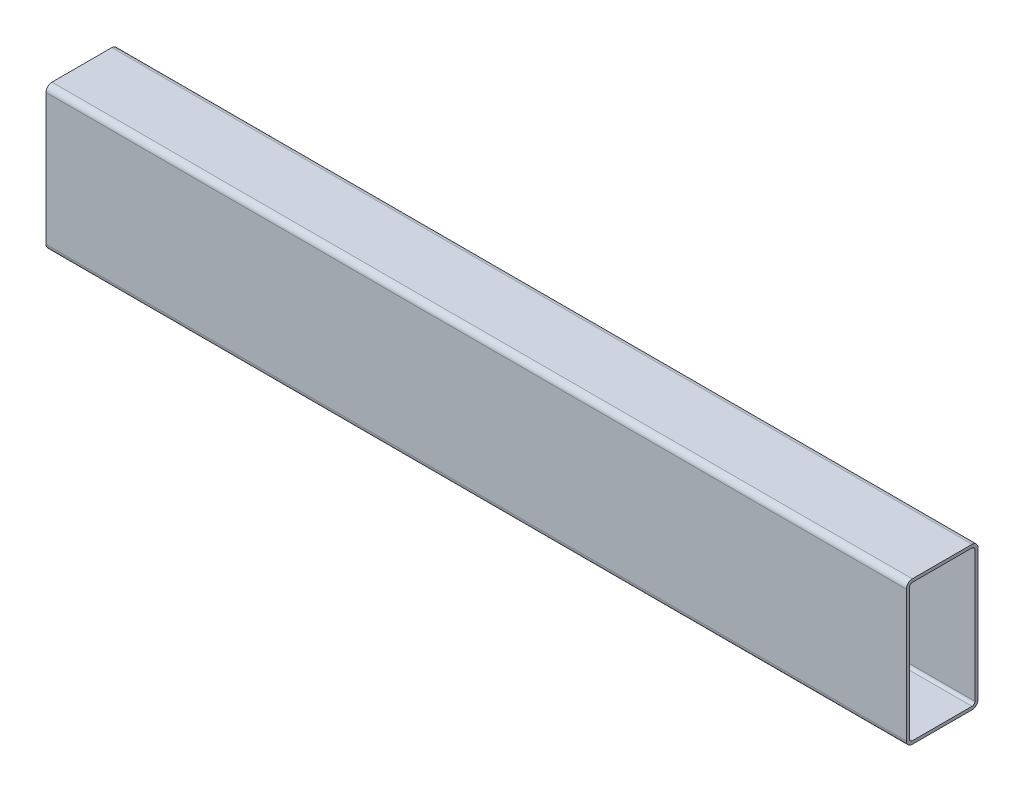
ISO-10303-21;
HEADER;
FILE_DESCRIPTION(('STEP AP214'),'2;1');
FILE_NAME('part.step','',(''),(''),'','','');
FILE_SCHEMA(('AUTOMOTIVE_DESIGN { 1 0 10303 214 1 1 1 1 }'));
ENDSEC;
DATA;
#1=APPLICATION_CONTEXT('core data for automotive mechanical design processes');
#2=APPLICATION_PROTOCOL_DEFINITION('international standard','automotive_design',2000,#1);
#3=PRODUCT_CONTEXT('',#1,'mechanical');
#4=PRODUCT('Part','Part','',(#3));
#5=PRODUCT_RELATED_PRODUCT_CATEGORY('part','',(#4));
#6=PRODUCT_DEFINITION_FORMATION('','',#4);
#7=PRODUCT_DEFINITION_CONTEXT('part definition',#1,'design');
#8=PRODUCT_DEFINITION('design','',#6,#7);
#9=PRODUCT_DEFINITION_SHAPE('','',#8);
#10=(LENGTH_UNIT() NAMED_UNIT(*) SI_UNIT(.MILLI.,.METRE.));
#11=(NAMED_UNIT(*) PLANE_ANGLE_UNIT() SI_UNIT($,.RADIAN.));
#12=(NAMED_UNIT(*) SI_UNIT($,.STERADIAN.) SOLID_ANGLE_UNIT());
#13=UNCERTAINTY_MEASURE_WITH_UNIT(LENGTH_MEASURE(1.E-05),#10,'distance_accuracy_value','');
#14=(GEOMETRIC_REPRESENTATION_CONTEXT(3) GLOBAL_UNCERTAINTY_ASSIGNED_CONTEXT((#13)) GLOBAL_UNIT_ASSIGNED_CONTEXT((#10,
#11,#12)) REPRESENTATION_CONTEXT('',''));
#15=CARTESIAN_POINT('',(0.,0.,0.));
#16=DIRECTION('',(0.,0.,1.));
#17=DIRECTION('',(1.,0.,0.));
#18=AXIS2_PLACEMENT_3D('',#15,#16,#17);
#19=CARTESIAN_POINT('',(457.2,-7.09083333333333,9.49713055555553));
#20=DIRECTION('',(1.,0.,0.));
#21=DIRECTION('',(0.,0.,-1.));
#22=AXIS2_PLACEMENT_3D('',#19,#20,#21);
#23=PLANE('',#22);
#24=CARTESIAN_POINT('',(457.2,-7.09083333333333,9.49713055555553));
#25=DIRECTION('',(1.,0.,0.));
#26=DIRECTION('',(0.,0.,-1.));
#27=AXIS2_PLACEMENT_3D('',#24,#25,#26);
#28=CIRCLE('',#27,3.175);
#29=CARTESIAN_POINT('',(457.2,-7.09083333333333,12.6721305555555));
#30=VERTEX_POINT('',#29);
#31=CARTESIAN_POINT('',(457.2,-10.2658333333333,9.49713055555553));
#32=VERTEX_POINT('',#31);
#33=EDGE_CURVE('E262',#30,#32,#28,.T.);
#34=ORIENTED_EDGE('',*,*,#33,.T.);
#35=DIRECTION('',(0.,0.,-1.));
#36=VECTOR('',#35,1.);
#37=CARTESIAN_POINT('',(457.2,-10.2658333333333,9.49713055555553));
#38=LINE('',#37,#36);
#39=CARTESIAN_POINT('',(457.2,-10.2658333333333,-22.2528694444445));
#40=VERTEX_POINT('',#39);
#41=EDGE_CURVE('E265',#32,#40,#38,.T.);
#42=ORIENTED_EDGE('',*,*,#41,.T.);
#43=CARTESIAN_POINT('',(457.2,-7.09083333333333,-22.2528694444445));
#44=DIRECTION('',(1.,0.,0.));
#45=DIRECTION('',(0.,0.,-1.));
#46=AXIS2_PLACEMENT_3D('',#43,#44,#45);
#47=CIRCLE('',#46,3.175);
#48=CARTESIAN_POINT('',(457.2,-7.09083333333333,-25.4278694444445));
#49=VERTEX_POINT('',#48);
#50=EDGE_CURVE('E268',#40,#49,#47,.T.);
#51=ORIENTED_EDGE('',*,*,#50,.T.);
#52=DIRECTION('',(0.,1.,0.));
#53=VECTOR('',#52,1.);
#54=CARTESIAN_POINT('',(457.2,-7.09083333333333,-25.4278694444445));
#55=LINE('',#54,#53);
#56=CARTESIAN_POINT('',(457.2,62.7591666666666,-25.4278694444445));
#57=VERTEX_POINT('',#56);
#58=EDGE_CURVE('E270',#49,#57,#55,.T.);
#59=ORIENTED_EDGE('',*,*,#58,.T.);
#60=CARTESIAN_POINT('',(457.2,62.7591666666667,-22.2528694444445));
#61=DIRECTION('',(1.,0.,0.));
#62=DIRECTION('',(0.,0.,-1.));
#63=AXIS2_PLACEMENT_3D('',#60,#61,#62);
#64=CIRCLE('',#63,3.175);
#65=CARTESIAN_POINT('',(457.2,65.9341666666667,-22.2528694444445));
#66=VERTEX_POINT('',#65);
#67=EDGE_CURVE('E272',#57,#66,#64,.T.);
#68=ORIENTED_EDGE('',*,*,#67,.T.);
#69=DIRECTION('',(0.,0.,-1.));
#70=VECTOR('',#69,1.);
#71=CARTESIAN_POINT('',(457.2,65.9341666666667,9.4971305555555));
#72=LINE('',#71,#70);
#73=CARTESIAN_POINT('',(457.2,65.9341666666667,9.4971305555555));
#74=VERTEX_POINT('',#73);
#75=EDGE_CURVE('E274',#74,#66,#72,.T.);
#76=ORIENTED_EDGE('',*,*,#75,.F.);
#77=CARTESIAN_POINT('',(457.2,62.7591666666667,9.49713055555553));
#78=DIRECTION('',(-1.,0.,0.));
#79=DIRECTION('',(0.,0.,1.));
#80=AXIS2_PLACEMENT_3D('',#77,#78,#79);
#81=CIRCLE('',#80,3.175);
#82=CARTESIAN_POINT('',(457.2,62.7591666666666,12.6721305555555));
#83=VERTEX_POINT('',#82);
#84=EDGE_CURVE('E277',#83,#74,#81,.T.);
#85=ORIENTED_EDGE('',*,*,#84,.F.);
#86=DIRECTION('',(0.,1.,0.));
#87=VECTOR('',#86,1.);
#88=CARTESIAN_POINT('',(457.2,-7.09083333333333,12.6721305555555));
#89=LINE('',#88,#87);
#90=EDGE_CURVE('E280',#30,#83,#89,.T.);
#91=ORIENTED_EDGE('',*,*,#90,.F.);
#92=EDGE_LOOP('',(#34,#42,#51,#59,#68,#76,#85,#91));
#93=FACE_BOUND('',#92,.T.);
#94=DIRECTION('',(0.,0.,-1.));
#95=VECTOR('',#94,1.);
#96=CARTESIAN_POINT('',(457.2,-8.61483333333334,9.49713055555553));
#97=LINE('',#96,#95);
#98=CARTESIAN_POINT('',(457.2,-8.61483333333334,9.49713055555553));
#99=VERTEX_POINT('',#98);
#100=CARTESIAN_POINT('',(457.2,-8.61483333333334,-22.2528694444445));
#101=VERTEX_POINT('',#100);
#102=EDGE_CURVE('E204',#99,#101,#97,.T.);
#103=ORIENTED_EDGE('',*,*,#102,.F.);
#104=CARTESIAN_POINT('',(457.2,-7.09083333333333,9.49713055555553));
#105=DIRECTION('',(1.,0.,0.));
#106=DIRECTION('',(0.,0.,-1.));
#107=AXIS2_PLACEMENT_3D('',#104,#105,#106);
#108=CIRCLE('',#107,1.524);
#109=CARTESIAN_POINT('',(457.2,-7.09083333333333,11.0211305555555));
#110=VERTEX_POINT('',#109);
#111=EDGE_CURVE('E195',#110,#99,#108,.T.);
#112=ORIENTED_EDGE('',*,*,#111,.F.);
#113=DIRECTION('',(0.,1.,0.));
#114=VECTOR('',#113,1.);
#115=CARTESIAN_POINT('',(457.2,-7.09083333333333,11.0211305555555));
#116=LINE('',#115,#114);
#117=CARTESIAN_POINT('',(457.2,62.7591666666666,11.0211305555555));
#118=VERTEX_POINT('',#117);
#119=EDGE_CURVE('E229',#110,#118,#116,.T.);
#120=ORIENTED_EDGE('',*,*,#119,.T.);
#121=CARTESIAN_POINT('',(457.2,62.7591666666667,9.49713055555553));
#122=DIRECTION('',(1.,0.,0.));
#123=DIRECTION('',(0.,0.,-1.));
#124=AXIS2_PLACEMENT_3D('',#121,#122,#123);
#125=CIRCLE('',#124,1.524);
#126=CARTESIAN_POINT('',(457.2,64.2831666666667,9.49713055555551));
#127=VERTEX_POINT('',#126);
#128=EDGE_CURVE('E98',#118,#127,#125,.F.);
#129=ORIENTED_EDGE('',*,*,#128,.T.);
#130=DIRECTION('',(0.,0.,-1.));
#131=VECTOR('',#130,1.);
#132=CARTESIAN_POINT('',(457.2,64.2831666666667,9.4971305555555));
#133=LINE('',#132,#131);
#134=CARTESIAN_POINT('',(457.2,64.2831666666667,-22.2528694444444));
#135=VERTEX_POINT('',#134);
#136=EDGE_CURVE('E225',#127,#135,#133,.T.);
#137=ORIENTED_EDGE('',*,*,#136,.T.);
#138=CARTESIAN_POINT('',(457.2,62.7591666666667,-22.2528694444445));
#139=DIRECTION('',(1.,0.,0.));
#140=DIRECTION('',(0.,0.,-1.));
#141=AXIS2_PLACEMENT_3D('',#138,#139,#140);
#142=CIRCLE('',#141,1.524);
#143=CARTESIAN_POINT('',(457.2,62.7591666666666,-23.7768694444445));
#144=VERTEX_POINT('',#143);
#145=EDGE_CURVE('E223',#144,#135,#142,.T.);
#146=ORIENTED_EDGE('',*,*,#145,.F.);
#147=DIRECTION('',(0.,1.,0.));
#148=VECTOR('',#147,1.);
#149=CARTESIAN_POINT('',(457.2,-7.09083333333333,-23.7768694444445));
#150=LINE('',#149,#148);
#151=CARTESIAN_POINT('',(457.2,-7.09083333333333,-23.7768694444445));
#152=VERTEX_POINT('',#151);
#153=EDGE_CURVE('E219',#152,#144,#150,.T.);
#154=ORIENTED_EDGE('',*,*,#153,.F.);
#155=CARTESIAN_POINT('',(457.2,-7.09083333333333,-22.2528694444445));
#156=DIRECTION('',(1.,0.,0.));
#157=DIRECTION('',(0.,0.,-1.));
#158=AXIS2_PLACEMENT_3D('',#155,#156,#157);
#159=CIRCLE('',#158,1.524);
#160=EDGE_CURVE('E217',#101,#152,#159,.T.);
#161=ORIENTED_EDGE('',*,*,#160,.F.);
#162=EDGE_LOOP('',(#103,#112,#120,#129,#137,#146,#154,#161));
#163=FACE_BOUND('',#162,.T.);
#164=ADVANCED_FACE('F83',(#93,#163),#23,.T.);
#165=CARTESIAN_POINT('',(0.,-7.09083333333333,9.49713055555553));
#166=DIRECTION('',(1.,0.,0.));
#167=DIRECTION('',(0.,0.,-1.));
#168=AXIS2_PLACEMENT_3D('',#165,#166,#167);
#169=PLANE('',#168);
#170=CARTESIAN_POINT('',(0.,-7.09083333333333,9.49713055555553));
#171=DIRECTION('',(1.,0.,0.));
#172=DIRECTION('',(0.,0.,-1.));
#173=AXIS2_PLACEMENT_3D('',#170,#171,#172);
#174=CIRCLE('',#173,3.175);
#175=CARTESIAN_POINT('',(0.,-7.09083333333333,12.6721305555555));
#176=VERTEX_POINT('',#175);
#177=CARTESIAN_POINT('',(0.,-10.2658333333333,9.49713055555553));
#178=VERTEX_POINT('',#177);
#179=EDGE_CURVE('E212',#176,#178,#174,.T.);
#180=ORIENTED_EDGE('',*,*,#179,.F.);
#181=DIRECTION('',(0.,1.,0.));
#182=VECTOR('',#181,1.);
#183=CARTESIAN_POINT('',(0.,-7.09083333333333,12.6721305555555));
#184=LINE('',#183,#182);
#185=CARTESIAN_POINT('',(0.,62.7591666666666,12.6721305555555));
#186=VERTEX_POINT('',#185);
#187=EDGE_CURVE('E266',#176,#186,#184,.T.);
#188=ORIENTED_EDGE('',*,*,#187,.T.);
#189=CARTESIAN_POINT('',(0.,62.7591666666667,9.49713055555553));
#190=DIRECTION('',(-1.,0.,0.));
#191=DIRECTION('',(0.,0.,1.));
#192=AXIS2_PLACEMENT_3D('',#189,#190,#191);
#193=CIRCLE('',#192,3.175);
#194=CARTESIAN_POINT('',(0.,65.9341666666667,9.4971305555555));
#195=VERTEX_POINT('',#194);
#196=EDGE_CURVE('E298',#186,#195,#193,.T.);
#197=ORIENTED_EDGE('',*,*,#196,.T.);
#198=DIRECTION('',(0.,0.,-1.));
#199=VECTOR('',#198,1.);
#200=CARTESIAN_POINT('',(0.,65.9341666666667,9.4971305555555));
#201=LINE('',#200,#199);
#202=CARTESIAN_POINT('',(0.,65.9341666666667,-22.2528694444445));
#203=VERTEX_POINT('',#202);
#204=EDGE_CURVE('E295',#195,#203,#201,.T.);
#205=ORIENTED_EDGE('',*,*,#204,.T.);
#206=CARTESIAN_POINT('',(0.,62.7591666666667,-22.2528694444445));
#207=DIRECTION('',(1.,0.,0.));
#208=DIRECTION('',(0.,0.,-1.));
#209=AXIS2_PLACEMENT_3D('',#206,#207,#208);
#210=CIRCLE('',#209,3.175);
#211=CARTESIAN_POINT('',(0.,62.7591666666666,-25.4278694444445));
#212=VERTEX_POINT('',#211);
#213=EDGE_CURVE('E292',#212,#203,#210,.T.);
#214=ORIENTED_EDGE('',*,*,#213,.F.);
#215=DIRECTION('',(0.,1.,0.));
#216=VECTOR('',#215,1.);
#217=CARTESIAN_POINT('',(0.,-7.09083333333333,-25.4278694444445));
#218=LINE('',#217,#216);
#219=CARTESIAN_POINT('',(0.,-7.09083333333333,-25.4278694444445));
#220=VERTEX_POINT('',#219);
#221=EDGE_CURVE('E290',#220,#212,#218,.T.);
#222=ORIENTED_EDGE('',*,*,#221,.F.);
#223=CARTESIAN_POINT('',(0.,-7.09083333333333,-22.2528694444445));
#224=DIRECTION('',(1.,0.,0.));
#225=DIRECTION('',(0.,0.,-1.));
#226=AXIS2_PLACEMENT_3D('',#223,#224,#225);
#227=CIRCLE('',#226,3.175);
#228=CARTESIAN_POINT('',(0.,-10.2658333333333,-22.2528694444445));
#229=VERTEX_POINT('',#228);
#230=EDGE_CURVE('E288',#229,#220,#227,.T.);
#231=ORIENTED_EDGE('',*,*,#230,.F.);
#232=DIRECTION('',(0.,0.,-1.));
#233=VECTOR('',#232,1.);
#234=CARTESIAN_POINT('',(0.,-10.2658333333333,9.49713055555553));
#235=LINE('',#234,#233);
#236=EDGE_CURVE('E286',#178,#229,#235,.T.);
#237=ORIENTED_EDGE('',*,*,#236,.F.);
#238=EDGE_LOOP('',(#180,#188,#197,#205,#214,#222,#231,#237));
#239=FACE_BOUND('',#238,.T.);
#240=CARTESIAN_POINT('',(0.,-7.09083333333333,9.49713055555553));
#241=DIRECTION('',(1.,0.,0.));
#242=DIRECTION('',(0.,0.,-1.));
#243=AXIS2_PLACEMENT_3D('',#240,#241,#242);
#244=CIRCLE('',#243,1.524);
#245=CARTESIAN_POINT('',(0.,-7.09083333333333,11.0211305555555));
#246=VERTEX_POINT('',#245);
#247=CARTESIAN_POINT('',(0.,-8.61483333333334,9.49713055555553));
#248=VERTEX_POINT('',#247);
#249=EDGE_CURVE('E106',#246,#248,#244,.T.);
#250=ORIENTED_EDGE('',*,*,#249,.T.);
#251=DIRECTION('',(0.,0.,-1.));
#252=VECTOR('',#251,1.);
#253=CARTESIAN_POINT('',(0.,-8.61483333333334,9.49713055555553));
#254=LINE('',#253,#252);
#255=CARTESIAN_POINT('',(0.,-8.61483333333334,-22.2528694444445));
#256=VERTEX_POINT('',#255);
#257=EDGE_CURVE('E211',#248,#256,#254,.T.);
#258=ORIENTED_EDGE('',*,*,#257,.T.);
#259=CARTESIAN_POINT('',(0.,-7.09083333333333,-22.2528694444445));
#260=DIRECTION('',(1.,0.,0.));
#261=DIRECTION('',(0.,0.,-1.));
#262=AXIS2_PLACEMENT_3D('',#259,#260,#261);
#263=CIRCLE('',#262,1.524);
#264=CARTESIAN_POINT('',(0.,-7.09083333333333,-23.7768694444445));
#265=VERTEX_POINT('',#264);
#266=EDGE_CURVE('E233',#256,#265,#263,.T.);
#267=ORIENTED_EDGE('',*,*,#266,.T.);
#268=DIRECTION('',(0.,1.,0.));
#269=VECTOR('',#268,1.);
#270=CARTESIAN_POINT('',(0.,-7.09083333333333,-23.7768694444445));
#271=LINE('',#270,#269);
#272=CARTESIAN_POINT('',(0.,62.7591666666666,-23.7768694444445));
#273=VERTEX_POINT('',#272);
#274=EDGE_CURVE('E236',#265,#273,#271,.T.);
#275=ORIENTED_EDGE('',*,*,#274,.T.);
#276=CARTESIAN_POINT('',(0.,62.7591666666667,-22.2528694444445));
#277=DIRECTION('',(1.,0.,0.));
#278=DIRECTION('',(0.,0.,-1.));
#279=AXIS2_PLACEMENT_3D('',#276,#277,#278);
#280=CIRCLE('',#279,1.524);
#281=CARTESIAN_POINT('',(0.,64.2831666666667,-22.2528694444444));
#282=VERTEX_POINT('',#281);
#283=EDGE_CURVE('E239',#273,#282,#280,.T.);
#284=ORIENTED_EDGE('',*,*,#283,.T.);
#285=DIRECTION('',(0.,0.,-1.));
#286=VECTOR('',#285,1.);
#287=CARTESIAN_POINT('',(0.,64.2831666666667,9.4971305555555));
#288=LINE('',#287,#286);
#289=CARTESIAN_POINT('',(0.,64.2831666666667,9.49713055555551));
#290=VERTEX_POINT('',#289);
#291=EDGE_CURVE('E242',#290,#282,#288,.T.);
#292=ORIENTED_EDGE('',*,*,#291,.F.);
#293=CARTESIAN_POINT('',(0.,62.7591666666667,9.49713055555553));
#294=DIRECTION('',(1.,0.,0.));
#295=DIRECTION('',(0.,0.,-1.));
#296=AXIS2_PLACEMENT_3D('',#293,#294,#295);
#297=CIRCLE('',#296,1.524);
#298=CARTESIAN_POINT('',(0.,62.7591666666666,11.0211305555555));
#299=VERTEX_POINT('',#298);
#300=EDGE_CURVE('E245',#299,#290,#297,.F.);
#301=ORIENTED_EDGE('',*,*,#300,.F.);
#302=DIRECTION('',(0.,1.,0.));
#303=VECTOR('',#302,1.);
#304=CARTESIAN_POINT('',(0.,-7.09083333333333,11.0211305555555));
#305=LINE('',#304,#303);
#306=EDGE_CURVE('E205',#246,#299,#305,.T.);
#307=ORIENTED_EDGE('',*,*,#306,.F.);
#308=EDGE_LOOP('',(#250,#258,#267,#275,#284,#292,#301,#307));
#309=FACE_BOUND('',#308,.T.);
#310=ADVANCED_FACE('F326',(#239,#309),#169,.F.);
#311=CARTESIAN_POINT('',(457.2,-7.09083333333333,9.49713055555553));
#312=DIRECTION('',(-1.,0.,0.));
#313=DIRECTION('',(0.,0.,1.));
#314=AXIS2_PLACEMENT_3D('',#311,#312,#313);
#315=CYLINDRICAL_SURFACE('',#314,3.175);
#316=ORIENTED_EDGE('',*,*,#179,.T.);
#317=DIRECTION('',(-1.,0.,0.));
#318=VECTOR('',#317,1.);
#319=CARTESIAN_POINT('',(457.2,-10.2658333333333,9.49713055555553));
#320=LINE('',#319,#318);
#321=EDGE_CURVE('E12',#32,#178,#320,.T.);
#322=ORIENTED_EDGE('',*,*,#321,.F.);
#323=ORIENTED_EDGE('',*,*,#33,.F.);
#324=DIRECTION('',(-1.,0.,0.));
#325=VECTOR('',#324,1.);
#326=CARTESIAN_POINT('',(457.2,-7.09083333333333,12.6721305555555));
#327=LINE('',#326,#325);
#328=EDGE_CURVE('E283',#30,#176,#327,.T.);
#329=ORIENTED_EDGE('',*,*,#328,.T.);
#330=EDGE_LOOP('',(#316,#322,#323,#329));
#331=FACE_BOUND('',#330,.T.);
#332=ADVANCED_FACE('F85',(#331),#315,.T.);
#333=CARTESIAN_POINT('',(457.2,-10.2658333333333,9.49713055555553));
#334=DIRECTION('',(0.,1.,0.));
#335=DIRECTION('',(0.,0.,1.));
#336=AXIS2_PLACEMENT_3D('',#333,#334,#335);
#337=PLANE('',#336);
#338=ORIENTED_EDGE('',*,*,#236,.T.);
#339=DIRECTION('',(-1.,0.,0.));
#340=VECTOR('',#339,1.);
#341=CARTESIAN_POINT('',(457.2,-10.2658333333333,-22.2528694444445));
#342=LINE('',#341,#340);
#343=EDGE_CURVE('E91',#40,#229,#342,.T.);
#344=ORIENTED_EDGE('',*,*,#343,.F.);
#345=ORIENTED_EDGE('',*,*,#41,.F.);
#346=ORIENTED_EDGE('',*,*,#321,.T.);
#347=EDGE_LOOP('',(#338,#344,#345,#346));
#348=FACE_BOUND('',#347,.T.);
#349=ADVANCED_FACE('F343',(#348),#337,.F.);
#350=CARTESIAN_POINT('',(457.2,-7.09083333333333,-22.2528694444445));
#351=DIRECTION('',(-1.,0.,0.));
#352=DIRECTION('',(0.,0.,1.));
#353=AXIS2_PLACEMENT_3D('',#350,#351,#352);
#354=CYLINDRICAL_SURFACE('',#353,3.175);
#355=ORIENTED_EDGE('',*,*,#230,.T.);
#356=DIRECTION('',(-1.,0.,0.));
#357=VECTOR('',#356,1.);
#358=CARTESIAN_POINT('',(457.2,-7.09083333333333,-25.4278694444445));
#359=LINE('',#358,#357);
#360=EDGE_CURVE('E313',#49,#220,#359,.T.);
#361=ORIENTED_EDGE('',*,*,#360,.F.);
#362=ORIENTED_EDGE('',*,*,#50,.F.);
#363=ORIENTED_EDGE('',*,*,#343,.T.);
#364=EDGE_LOOP('',(#355,#361,#362,#363));
#365=FACE_BOUND('',#364,.T.);
#366=ADVANCED_FACE('F320',(#365),#354,.T.);
#367=CARTESIAN_POINT('',(457.2,-7.09083333333333,-25.4278694444445));
#368=DIRECTION('',(0.,0.,1.));
#369=DIRECTION('',(1.,0.,0.));
#370=AXIS2_PLACEMENT_3D('',#367,#368,#369);
#371=PLANE('',#370);
#372=ORIENTED_EDGE('',*,*,#221,.T.);
#373=DIRECTION('',(-1.,0.,0.));
#374=VECTOR('',#373,1.);
#375=CARTESIAN_POINT('',(457.2,62.7591666666666,-25.4278694444445));
#376=LINE('',#375,#374);
#377=EDGE_CURVE('E310',#57,#212,#376,.T.);
#378=ORIENTED_EDGE('',*,*,#377,.F.);
#379=ORIENTED_EDGE('',*,*,#58,.F.);
#380=ORIENTED_EDGE('',*,*,#360,.T.);
#381=EDGE_LOOP('',(#372,#378,#379,#380));
#382=FACE_BOUND('',#381,.T.);
#383=ADVANCED_FACE('F331',(#382),#371,.F.);
#384=CARTESIAN_POINT('',(457.2,62.7591666666667,-22.2528694444445));
#385=DIRECTION('',(-1.,0.,0.));
#386=DIRECTION('',(0.,0.,1.));
#387=AXIS2_PLACEMENT_3D('',#384,#385,#386);
#388=CYLINDRICAL_SURFACE('',#387,3.175);
#389=ORIENTED_EDGE('',*,*,#213,.T.);
#390=DIRECTION('',(-1.,0.,0.));
#391=VECTOR('',#390,1.);
#392=CARTESIAN_POINT('',(457.2,65.9341666666667,-22.2528694444445));
#393=LINE('',#392,#391);
#394=EDGE_CURVE('E308',#66,#203,#393,.T.);
#395=ORIENTED_EDGE('',*,*,#394,.F.);
#396=ORIENTED_EDGE('',*,*,#67,.F.);
#397=ORIENTED_EDGE('',*,*,#377,.T.);
#398=EDGE_LOOP('',(#389,#395,#396,#397));
#399=FACE_BOUND('',#398,.T.);
#400=ADVANCED_FACE('F335',(#399),#388,.T.);
#401=CARTESIAN_POINT('',(457.2,65.9341666666667,9.4971305555555));
#402=DIRECTION('',(0.,1.,0.));
#403=DIRECTION('',(0.,0.,1.));
#404=AXIS2_PLACEMENT_3D('',#401,#402,#403);
#405=PLANE('',#404);
#406=ORIENTED_EDGE('',*,*,#204,.F.);
#407=DIRECTION('',(-1.,0.,0.));
#408=VECTOR('',#407,1.);
#409=CARTESIAN_POINT('',(457.2,65.9341666666667,9.4971305555555));
#410=LINE('',#409,#408);
#411=EDGE_CURVE('E306',#74,#195,#410,.T.);
#412=ORIENTED_EDGE('',*,*,#411,.F.);
#413=ORIENTED_EDGE('',*,*,#75,.T.);
#414=ORIENTED_EDGE('',*,*,#394,.T.);
#415=EDGE_LOOP('',(#406,#412,#413,#414));
#416=FACE_BOUND('',#415,.T.);
#417=ADVANCED_FACE('F353',(#416),#405,.T.);
#418=CARTESIAN_POINT('',(457.2,62.7591666666667,9.49713055555553));
#419=DIRECTION('',(-1.,0.,0.));
#420=DIRECTION('',(0.,0.,1.));
#421=AXIS2_PLACEMENT_3D('',#418,#419,#420);
#422=CYLINDRICAL_SURFACE('',#421,3.175);
#423=ORIENTED_EDGE('',*,*,#196,.F.);
#424=DIRECTION('',(-1.,0.,0.));
#425=VECTOR('',#424,1.);
#426=CARTESIAN_POINT('',(457.2,62.7591666666666,12.6721305555555));
#427=LINE('',#426,#425);
#428=EDGE_CURVE('E304',#83,#186,#427,.T.);
#429=ORIENTED_EDGE('',*,*,#428,.F.);
#430=ORIENTED_EDGE('',*,*,#84,.T.);
#431=ORIENTED_EDGE('',*,*,#411,.T.);
#432=EDGE_LOOP('',(#423,#429,#430,#431));
#433=FACE_BOUND('',#432,.T.);
#434=ADVANCED_FACE('F350',(#433),#422,.T.);
#435=CARTESIAN_POINT('',(457.2,-7.09083333333333,12.6721305555555));
#436=DIRECTION('',(0.,0.,1.));
#437=DIRECTION('',(1.,0.,0.));
#438=AXIS2_PLACEMENT_3D('',#435,#436,#437);
#439=PLANE('',#438);
#440=ORIENTED_EDGE('',*,*,#187,.F.);
#441=ORIENTED_EDGE('',*,*,#328,.F.);
#442=ORIENTED_EDGE('',*,*,#90,.T.);
#443=ORIENTED_EDGE('',*,*,#428,.T.);
#444=EDGE_LOOP('',(#440,#441,#442,#443));
#445=FACE_BOUND('',#444,.T.);
#446=ADVANCED_FACE('F347',(#445),#439,.T.);
#447=CARTESIAN_POINT('',(457.2,-7.09083333333333,9.49713055555553));
#448=DIRECTION('',(-1.,0.,0.));
#449=DIRECTION('',(0.,0.,1.));
#450=AXIS2_PLACEMENT_3D('',#447,#448,#449);
#451=CYLINDRICAL_SURFACE('',#450,1.524);
#452=ORIENTED_EDGE('',*,*,#249,.F.);
#453=DIRECTION('',(-1.,0.,0.));
#454=VECTOR('',#453,1.);
#455=CARTESIAN_POINT('',(457.2,-7.09083333333333,11.0211305555555));
#456=LINE('',#455,#454);
#457=EDGE_CURVE('E199',#110,#246,#456,.T.);
#458=ORIENTED_EDGE('',*,*,#457,.F.);
#459=ORIENTED_EDGE('',*,*,#111,.T.);
#460=DIRECTION('',(-1.,0.,0.));
#461=VECTOR('',#460,1.);
#462=CARTESIAN_POINT('',(457.2,-8.61483333333334,9.49713055555553));
#463=LINE('',#462,#461);
#464=EDGE_CURVE('E198',#99,#248,#463,.T.);
#465=ORIENTED_EDGE('',*,*,#464,.T.);
#466=EDGE_LOOP('',(#452,#458,#459,#465));
#467=FACE_BOUND('',#466,.T.);
#468=ADVANCED_FACE('F197',(#467),#451,.F.);
#469=CARTESIAN_POINT('',(457.2,-8.61483333333334,9.49713055555553));
#470=DIRECTION('',(0.,1.,0.));
#471=DIRECTION('',(0.,0.,1.));
#472=AXIS2_PLACEMENT_3D('',#469,#470,#471);
#473=PLANE('',#472);
#474=ORIENTED_EDGE('',*,*,#257,.F.);
#475=ORIENTED_EDGE('',*,*,#464,.F.);
#476=ORIENTED_EDGE('',*,*,#102,.T.);
#477=DIRECTION('',(-1.,0.,0.));
#478=VECTOR('',#477,1.);
#479=CARTESIAN_POINT('',(457.2,-8.61483333333334,-22.2528694444445));
#480=LINE('',#479,#478);
#481=EDGE_CURVE('E213',#101,#256,#480,.T.);
#482=ORIENTED_EDGE('',*,*,#481,.T.);
#483=EDGE_LOOP('',(#474,#475,#476,#482));
#484=FACE_BOUND('',#483,.T.);
#485=ADVANCED_FACE('F208',(#484),#473,.T.);
#486=CARTESIAN_POINT('',(457.2,-7.09083333333333,-22.2528694444445));
#487=DIRECTION('',(-1.,0.,0.));
#488=DIRECTION('',(0.,0.,1.));
#489=AXIS2_PLACEMENT_3D('',#486,#487,#488);
#490=CYLINDRICAL_SURFACE('',#489,1.524);
#491=ORIENTED_EDGE('',*,*,#266,.F.);
#492=ORIENTED_EDGE('',*,*,#481,.F.);
#493=ORIENTED_EDGE('',*,*,#160,.T.);
#494=DIRECTION('',(-1.,0.,0.));
#495=VECTOR('',#494,1.);
#496=CARTESIAN_POINT('',(457.2,-7.09083333333333,-23.7768694444445));
#497=LINE('',#496,#495);
#498=EDGE_CURVE('E259',#152,#265,#497,.T.);
#499=ORIENTED_EDGE('',*,*,#498,.T.);
#500=EDGE_LOOP('',(#491,#492,#493,#499));
#501=FACE_BOUND('',#500,.T.);
#502=ADVANCED_FACE('F378',(#501),#490,.F.);
#503=CARTESIAN_POINT('',(457.2,-7.09083333333333,-23.7768694444445));
#504=DIRECTION('',(0.,0.,1.));
#505=DIRECTION('',(1.,0.,0.));
#506=AXIS2_PLACEMENT_3D('',#503,#504,#505);
#507=PLANE('',#506);
#508=ORIENTED_EDGE('',*,*,#274,.F.);
#509=ORIENTED_EDGE('',*,*,#498,.F.);
#510=ORIENTED_EDGE('',*,*,#153,.T.);
#511=DIRECTION('',(-1.,0.,0.));
#512=VECTOR('',#511,1.);
#513=CARTESIAN_POINT('',(457.2,62.7591666666666,-23.7768694444445));
#514=LINE('',#513,#512);
#515=EDGE_CURVE('E257',#144,#273,#514,.T.);
#516=ORIENTED_EDGE('',*,*,#515,.T.);
#517=EDGE_LOOP('',(#508,#509,#510,#516));
#518=FACE_BOUND('',#517,.T.);
#519=ADVANCED_FACE('F382',(#518),#507,.T.);
#520=CARTESIAN_POINT('',(457.2,62.7591666666667,-22.2528694444445));
#521=DIRECTION('',(-1.,0.,0.));
#522=DIRECTION('',(0.,0.,1.));
#523=AXIS2_PLACEMENT_3D('',#520,#521,#522);
#524=CYLINDRICAL_SURFACE('',#523,1.524);
#525=ORIENTED_EDGE('',*,*,#283,.F.);
#526=ORIENTED_EDGE('',*,*,#515,.F.);
#527=ORIENTED_EDGE('',*,*,#145,.T.);
#528=DIRECTION('',(-1.,0.,0.));
#529=VECTOR('',#528,1.);
#530=CARTESIAN_POINT('',(457.2,64.2831666666667,-22.2528694444444));
#531=LINE('',#530,#529);
#532=EDGE_CURVE('E255',#135,#282,#531,.T.);
#533=ORIENTED_EDGE('',*,*,#532,.T.);
#534=EDGE_LOOP('',(#525,#526,#527,#533));
#535=FACE_BOUND('',#534,.T.);
#536=ADVANCED_FACE('F388',(#535),#524,.F.);
#537=CARTESIAN_POINT('',(457.2,64.2831666666667,9.4971305555555));
#538=DIRECTION('',(0.,1.,0.));
#539=DIRECTION('',(0.,0.,1.));
#540=AXIS2_PLACEMENT_3D('',#537,#538,#539);
#541=PLANE('',#540);
#542=ORIENTED_EDGE('',*,*,#291,.T.);
#543=ORIENTED_EDGE('',*,*,#532,.F.);
#544=ORIENTED_EDGE('',*,*,#136,.F.);
#545=DIRECTION('',(-1.,0.,0.));
#546=VECTOR('',#545,1.);
#547=CARTESIAN_POINT('',(457.2,64.2831666666667,9.49713055555551));
#548=LINE('',#547,#546);
#549=EDGE_CURVE('E253',#127,#290,#548,.T.);
#550=ORIENTED_EDGE('',*,*,#549,.T.);
#551=EDGE_LOOP('',(#542,#543,#544,#550));
#552=FACE_BOUND('',#551,.T.);
#553=ADVANCED_FACE('F392',(#552),#541,.F.);
#554=CARTESIAN_POINT('',(457.2,62.7591666666667,9.49713055555553));
#555=DIRECTION('',(-1.,0.,0.));
#556=DIRECTION('',(0.,0.,1.));
#557=AXIS2_PLACEMENT_3D('',#554,#555,#556);
#558=CYLINDRICAL_SURFACE('',#557,1.524);
#559=ORIENTED_EDGE('',*,*,#300,.T.);
#560=ORIENTED_EDGE('',*,*,#549,.F.);
#561=ORIENTED_EDGE('',*,*,#128,.F.);
#562=DIRECTION('',(-1.,0.,0.));
#563=VECTOR('',#562,1.);
#564=CARTESIAN_POINT('',(457.2,62.7591666666666,11.0211305555555));
#565=LINE('',#564,#563);
#566=EDGE_CURVE('E251',#118,#299,#565,.T.);
#567=ORIENTED_EDGE('',*,*,#566,.T.);
#568=EDGE_LOOP('',(#559,#560,#561,#567));
#569=FACE_BOUND('',#568,.T.);
#570=ADVANCED_FACE('F396',(#569),#558,.F.);
#571=CARTESIAN_POINT('',(457.2,-7.09083333333333,11.0211305555555));
#572=DIRECTION('',(0.,0.,1.));
#573=DIRECTION('',(1.,0.,0.));
#574=AXIS2_PLACEMENT_3D('',#571,#572,#573);
#575=PLANE('',#574);
#576=ORIENTED_EDGE('',*,*,#306,.T.);
#577=ORIENTED_EDGE('',*,*,#566,.F.);
#578=ORIENTED_EDGE('',*,*,#119,.F.);
#579=ORIENTED_EDGE('',*,*,#457,.T.);
#580=EDGE_LOOP('',(#576,#577,#578,#579));
#581=FACE_BOUND('',#580,.T.);
#582=ADVANCED_FACE('F400',(#581),#575,.F.);
#583=CLOSED_SHELL('',(#164,#310,#332,#349,#366,#383,#400,#417,#434,#446,#468,#485,#502,#519,
#536,#553,#570,#582));
#584=MANIFOLD_SOLID_BREP('B2',#583);
#585=ADVANCED_BREP_SHAPE_REPRESENTATION('',(#18,#584),#14);
#586=SHAPE_DEFINITION_REPRESENTATION(#9,#585);
ENDSEC;
END-ISO-10303-21;
